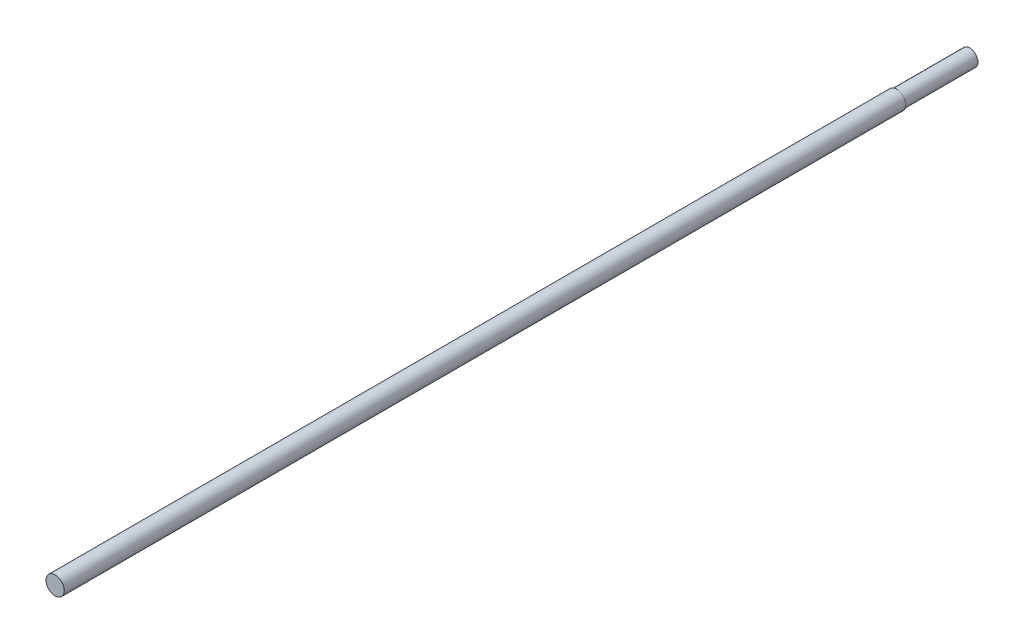
ISO-10303-21;
HEADER;
FILE_DESCRIPTION(('STEP AP214'),'2;1');
FILE_NAME('part.step','',(''),(''),'','','');
FILE_SCHEMA(('AUTOMOTIVE_DESIGN { 1 0 10303 214 1 1 1 1 }'));
ENDSEC;
DATA;
#1=APPLICATION_CONTEXT('core data for automotive mechanical design processes');
#2=APPLICATION_PROTOCOL_DEFINITION('international standard','automotive_design',2000,#1);
#3=PRODUCT_CONTEXT('',#1,'mechanical');
#4=PRODUCT('Part','Part','',(#3));
#5=PRODUCT_RELATED_PRODUCT_CATEGORY('part','',(#4));
#6=PRODUCT_DEFINITION_FORMATION('','',#4);
#7=PRODUCT_DEFINITION_CONTEXT('part definition',#1,'design');
#8=PRODUCT_DEFINITION('design','',#6,#7);
#9=PRODUCT_DEFINITION_SHAPE('','',#8);
#10=(LENGTH_UNIT() NAMED_UNIT(*) SI_UNIT(.MILLI.,.METRE.));
#11=(NAMED_UNIT(*) PLANE_ANGLE_UNIT() SI_UNIT($,.RADIAN.));
#12=(NAMED_UNIT(*) SI_UNIT($,.STERADIAN.) SOLID_ANGLE_UNIT());
#13=UNCERTAINTY_MEASURE_WITH_UNIT(LENGTH_MEASURE(1.E-05),#10,'distance_accuracy_value','');
#14=(GEOMETRIC_REPRESENTATION_CONTEXT(3) GLOBAL_UNCERTAINTY_ASSIGNED_CONTEXT((#13)) GLOBAL_UNIT_ASSIGNED_CONTEXT((#10,
#11,#12)) REPRESENTATION_CONTEXT('',''));
#15=CARTESIAN_POINT('',(0.,0.,0.));
#16=DIRECTION('',(0.,0.,1.));
#17=DIRECTION('',(1.,0.,0.));
#18=AXIS2_PLACEMENT_3D('',#15,#16,#17);
#19=CARTESIAN_POINT('',(0.,0.,460.));
#20=DIRECTION('',(0.,0.,1.));
#21=DIRECTION('',(1.,0.,0.));
#22=AXIS2_PLACEMENT_3D('',#19,#20,#21);
#23=PLANE('',#22);
#24=CARTESIAN_POINT('',(0.,0.,460.));
#25=DIRECTION('',(0.,0.,1.));
#26=DIRECTION('',(1.,0.,0.));
#27=AXIS2_PLACEMENT_3D('',#24,#25,#26);
#28=CIRCLE('',#27,5.);
#29=CARTESIAN_POINT('',(5.,0.,460.));
#30=VERTEX_POINT('',#29);
#31=EDGE_CURVE('P0_E18',#30,#30,#28,.F.);
#32=ORIENTED_EDGE('',*,*,#31,.F.);
#33=EDGE_LOOP('',(#32));
#34=FACE_BOUND('',#33,.T.);
#35=ADVANCED_FACE('P0_F15',(#34),#23,.T.);
#36=CARTESIAN_POINT('',(0.,0.,0.));
#37=DIRECTION('',(0.,0.,1.));
#38=DIRECTION('',(1.,0.,0.));
#39=AXIS2_PLACEMENT_3D('',#36,#37,#38);
#40=PLANE('',#39);
#41=CARTESIAN_POINT('',(0.,0.,0.));
#42=DIRECTION('',(0.,0.,1.));
#43=DIRECTION('',(1.,0.,0.));
#44=AXIS2_PLACEMENT_3D('',#41,#42,#43);
#45=CIRCLE('',#44,5.);
#46=CARTESIAN_POINT('',(5.,0.,0.));
#47=VERTEX_POINT('',#46);
#48=EDGE_CURVE('P0_E10',#47,#47,#45,.T.);
#49=ORIENTED_EDGE('',*,*,#48,.F.);
#50=EDGE_LOOP('',(#49));
#51=FACE_BOUND('',#50,.T.);
#52=ADVANCED_FACE('P0_F30',(#51),#40,.F.);
#53=CARTESIAN_POINT('',(0.,0.,0.));
#54=DIRECTION('',(0.,0.,1.));
#55=DIRECTION('',(1.,0.,0.));
#56=AXIS2_PLACEMENT_3D('',#53,#54,#55);
#57=CYLINDRICAL_SURFACE('',#56,5.);
#58=ORIENTED_EDGE('',*,*,#31,.T.);
#59=EDGE_LOOP('',(#58));
#60=FACE_BOUND('',#59,.T.);
#61=ORIENTED_EDGE('',*,*,#48,.T.);
#62=EDGE_LOOP('',(#61));
#63=FACE_BOUND('',#62,.T.);
#64=ADVANCED_FACE('P0_F27',(#60,#63),#57,.T.);
#65=CLOSED_SHELL('',(#35,#52,#64));
#66=MANIFOLD_SOLID_BREP('P0_B1',#65);
#67=CARTESIAN_POINT('',(0.,0.,460.));
#68=DIRECTION('',(0.,0.,1.));
#69=DIRECTION('',(1.,0.,0.));
#70=AXIS2_PLACEMENT_3D('',#67,#68,#69);
#71=CYLINDRICAL_SURFACE('',#70,4.5);
#72=CARTESIAN_POINT('',(0.,0.,-40.));
#73=DIRECTION('',(0.,0.,1.));
#74=DIRECTION('',(1.,0.,0.));
#75=AXIS2_PLACEMENT_3D('',#72,#73,#74);
#76=CIRCLE('',#75,4.5);
#77=CARTESIAN_POINT('',(4.5,0.,-40.));
#78=VERTEX_POINT('',#77);
#79=EDGE_CURVE('P1_E16',#78,#78,#76,.T.);
#80=ORIENTED_EDGE('',*,*,#79,.T.);
#81=EDGE_LOOP('',(#80));
#82=FACE_BOUND('',#81,.T.);
#83=CARTESIAN_POINT('',(0.,0.,460.));
#84=DIRECTION('',(0.,0.,1.));
#85=DIRECTION('',(1.,0.,0.));
#86=AXIS2_PLACEMENT_3D('',#83,#84,#85);
#87=CIRCLE('',#86,4.5);
#88=CARTESIAN_POINT('',(4.5,0.,460.));
#89=VERTEX_POINT('',#88);
#90=EDGE_CURVE('P1_E10',#89,#89,#87,.F.);
#91=ORIENTED_EDGE('',*,*,#90,.T.);
#92=EDGE_LOOP('',(#91));
#93=FACE_BOUND('',#92,.T.);
#94=ADVANCED_FACE('P1_F15',(#82,#93),#71,.T.);
#95=OPEN_SHELL('',(#94));
#96=SHELL_BASED_SURFACE_MODEL('P1_B1',(#95));
#97=ADVANCED_BREP_SHAPE_REPRESENTATION('',(#18,#66),#14);
#98=MANIFOLD_SURFACE_SHAPE_REPRESENTATION('',(#18,#96),#14);
#99=SHAPE_REPRESENTATION('',(#18),#14);
#100=SHAPE_DEFINITION_REPRESENTATION(#9,#99);
#101=SHAPE_REPRESENTATION_RELATIONSHIP('','',#99,#97);
#102=SHAPE_REPRESENTATION_RELATIONSHIP('','',#99,#98);
ENDSEC;
END-ISO-10303-21;
